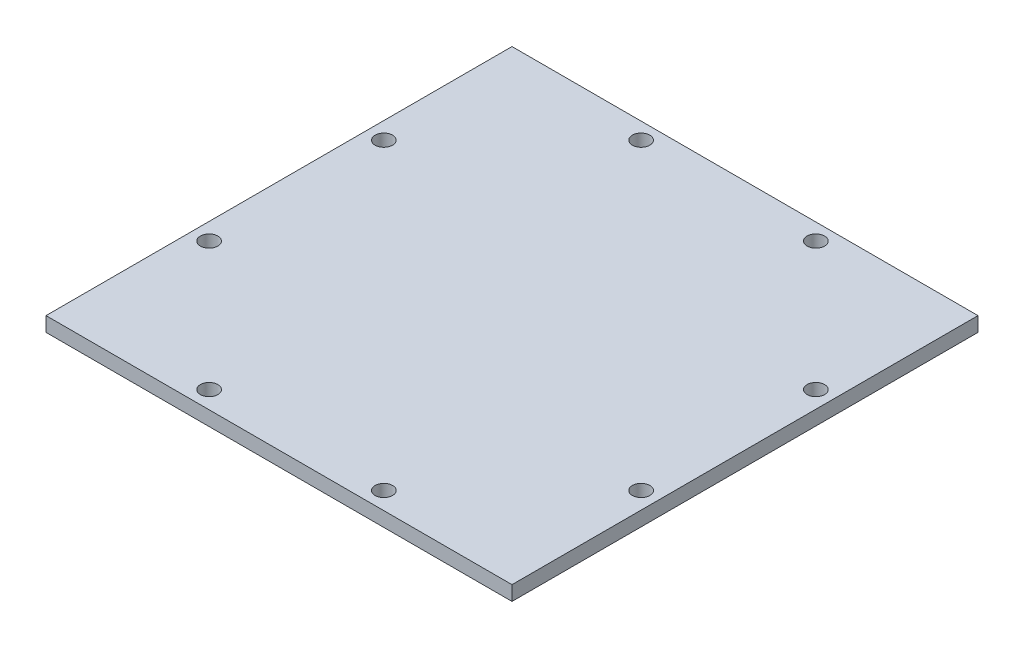
ISO-10303-21;
HEADER;
FILE_DESCRIPTION(('STEP AP214'),'2;1');
FILE_NAME('part.step','',(''),(''),'','','');
FILE_SCHEMA(('AUTOMOTIVE_DESIGN { 1 0 10303 214 1 1 1 1 }'));
ENDSEC;
DATA;
#1=APPLICATION_CONTEXT('core data for automotive mechanical design processes');
#2=APPLICATION_PROTOCOL_DEFINITION('international standard','automotive_design',2000,#1);
#3=PRODUCT_CONTEXT('',#1,'mechanical');
#4=PRODUCT('Part','Part','',(#3));
#5=PRODUCT_RELATED_PRODUCT_CATEGORY('part','',(#4));
#6=PRODUCT_DEFINITION_FORMATION('','',#4);
#7=PRODUCT_DEFINITION_CONTEXT('part definition',#1,'design');
#8=PRODUCT_DEFINITION('design','',#6,#7);
#9=PRODUCT_DEFINITION_SHAPE('','',#8);
#10=(LENGTH_UNIT() NAMED_UNIT(*) SI_UNIT(.MILLI.,.METRE.));
#11=(NAMED_UNIT(*) PLANE_ANGLE_UNIT() SI_UNIT($,.RADIAN.));
#12=(NAMED_UNIT(*) SI_UNIT($,.STERADIAN.) SOLID_ANGLE_UNIT());
#13=UNCERTAINTY_MEASURE_WITH_UNIT(LENGTH_MEASURE(1.E-05),#10,'distance_accuracy_value','');
#14=(GEOMETRIC_REPRESENTATION_CONTEXT(3) GLOBAL_UNCERTAINTY_ASSIGNED_CONTEXT((#13)) GLOBAL_UNIT_ASSIGNED_CONTEXT((#10,
#11,#12)) REPRESENTATION_CONTEXT('',''));
#15=CARTESIAN_POINT('',(0.,0.,0.));
#16=DIRECTION('',(0.,0.,1.));
#17=DIRECTION('',(1.,0.,0.));
#18=AXIS2_PLACEMENT_3D('',#15,#16,#17);
#19=CARTESIAN_POINT('',(40.,2.5,40.));
#20=DIRECTION('',(-1.,0.,0.));
#21=DIRECTION('',(0.,0.,1.));
#22=AXIS2_PLACEMENT_3D('',#19,#20,#21);
#23=PLANE('',#22);
#24=DIRECTION('',(0.,0.,-1.));
#25=VECTOR('',#24,1.);
#26=CARTESIAN_POINT('',(40.,0.,40.));
#27=LINE('',#26,#25);
#28=CARTESIAN_POINT('',(40.,0.,40.));
#29=VERTEX_POINT('',#28);
#30=CARTESIAN_POINT('',(40.,0.,-40.));
#31=VERTEX_POINT('',#30);
#32=EDGE_CURVE('E105',#29,#31,#27,.T.);
#33=ORIENTED_EDGE('',*,*,#32,.T.);
#34=DIRECTION('',(0.,-1.,0.));
#35=VECTOR('',#34,1.);
#36=CARTESIAN_POINT('',(40.,2.5,-40.));
#37=LINE('',#36,#35);
#38=CARTESIAN_POINT('',(40.,2.5,-40.));
#39=VERTEX_POINT('',#38);
#40=EDGE_CURVE('E11',#39,#31,#37,.T.);
#41=ORIENTED_EDGE('',*,*,#40,.F.);
#42=DIRECTION('',(0.,0.,-1.));
#43=VECTOR('',#42,1.);
#44=CARTESIAN_POINT('',(40.,2.5,40.));
#45=LINE('',#44,#43);
#46=CARTESIAN_POINT('',(40.,2.5,40.));
#47=VERTEX_POINT('',#46);
#48=EDGE_CURVE('E92',#47,#39,#45,.T.);
#49=ORIENTED_EDGE('',*,*,#48,.F.);
#50=DIRECTION('',(0.,-1.,0.));
#51=VECTOR('',#50,1.);
#52=CARTESIAN_POINT('',(40.,2.5,40.));
#53=LINE('',#52,#51);
#54=EDGE_CURVE('E101',#47,#29,#53,.T.);
#55=ORIENTED_EDGE('',*,*,#54,.T.);
#56=EDGE_LOOP('',(#33,#41,#49,#55));
#57=FACE_BOUND('',#56,.T.);
#58=ADVANCED_FACE('F39',(#57),#23,.F.);
#59=CARTESIAN_POINT('',(-40.,2.5,-40.));
#60=DIRECTION('',(0.,0.,1.));
#61=DIRECTION('',(1.,0.,0.));
#62=AXIS2_PLACEMENT_3D('',#59,#60,#61);
#63=PLANE('',#62);
#64=DIRECTION('',(-1.,0.,0.));
#65=VECTOR('',#64,1.);
#66=CARTESIAN_POINT('',(-40.,0.,-40.));
#67=LINE('',#66,#65);
#68=CARTESIAN_POINT('',(-40.,0.,-40.));
#69=VERTEX_POINT('',#68);
#70=EDGE_CURVE('E96',#31,#69,#67,.T.);
#71=ORIENTED_EDGE('',*,*,#70,.T.);
#72=DIRECTION('',(0.,-1.,0.));
#73=VECTOR('',#72,1.);
#74=CARTESIAN_POINT('',(-40.,2.5,-40.));
#75=LINE('',#74,#73);
#76=CARTESIAN_POINT('',(-40.,2.5,-40.));
#77=VERTEX_POINT('',#76);
#78=EDGE_CURVE('E48',#77,#69,#75,.T.);
#79=ORIENTED_EDGE('',*,*,#78,.F.);
#80=DIRECTION('',(-1.,0.,0.));
#81=VECTOR('',#80,1.);
#82=CARTESIAN_POINT('',(-40.,2.5,-40.));
#83=LINE('',#82,#81);
#84=EDGE_CURVE('E87',#39,#77,#83,.T.);
#85=ORIENTED_EDGE('',*,*,#84,.F.);
#86=ORIENTED_EDGE('',*,*,#40,.T.);
#87=EDGE_LOOP('',(#71,#79,#85,#86));
#88=FACE_BOUND('',#87,.T.);
#89=ADVANCED_FACE('F95',(#88),#63,.F.);
#90=CARTESIAN_POINT('',(-40.,2.5,40.));
#91=DIRECTION('',(1.,0.,0.));
#92=DIRECTION('',(0.,0.,-1.));
#93=AXIS2_PLACEMENT_3D('',#90,#91,#92);
#94=PLANE('',#93);
#95=DIRECTION('',(0.,0.,1.));
#96=VECTOR('',#95,1.);
#97=CARTESIAN_POINT('',(-40.,0.,40.));
#98=LINE('',#97,#96);
#99=CARTESIAN_POINT('',(-40.,0.,40.));
#100=VERTEX_POINT('',#99);
#101=EDGE_CURVE('E74',#69,#100,#98,.T.);
#102=ORIENTED_EDGE('',*,*,#101,.T.);
#103=DIRECTION('',(0.,-1.,0.));
#104=VECTOR('',#103,1.);
#105=CARTESIAN_POINT('',(-40.,2.5,40.));
#106=LINE('',#105,#104);
#107=CARTESIAN_POINT('',(-40.,2.5,40.));
#108=VERTEX_POINT('',#107);
#109=EDGE_CURVE('E97',#108,#100,#106,.T.);
#110=ORIENTED_EDGE('',*,*,#109,.F.);
#111=DIRECTION('',(0.,0.,1.));
#112=VECTOR('',#111,1.);
#113=CARTESIAN_POINT('',(-40.,2.5,40.));
#114=LINE('',#113,#112);
#115=EDGE_CURVE('E90',#77,#108,#114,.T.);
#116=ORIENTED_EDGE('',*,*,#115,.F.);
#117=ORIENTED_EDGE('',*,*,#78,.T.);
#118=EDGE_LOOP('',(#102,#110,#116,#117));
#119=FACE_BOUND('',#118,.T.);
#120=ADVANCED_FACE('F99',(#119),#94,.F.);
#121=CARTESIAN_POINT('',(-40.,2.5,40.));
#122=DIRECTION('',(0.,0.,-1.));
#123=DIRECTION('',(-1.,0.,0.));
#124=AXIS2_PLACEMENT_3D('',#121,#122,#123);
#125=PLANE('',#124);
#126=DIRECTION('',(1.,0.,0.));
#127=VECTOR('',#126,1.);
#128=CARTESIAN_POINT('',(-40.,0.,40.));
#129=LINE('',#128,#127);
#130=EDGE_CURVE('E80',#100,#29,#129,.T.);
#131=ORIENTED_EDGE('',*,*,#130,.T.);
#132=ORIENTED_EDGE('',*,*,#54,.F.);
#133=DIRECTION('',(1.,0.,0.));
#134=VECTOR('',#133,1.);
#135=CARTESIAN_POINT('',(-40.,2.5,40.));
#136=LINE('',#135,#134);
#137=EDGE_CURVE('E57',#108,#47,#136,.T.);
#138=ORIENTED_EDGE('',*,*,#137,.F.);
#139=ORIENTED_EDGE('',*,*,#109,.T.);
#140=EDGE_LOOP('',(#131,#132,#138,#139));
#141=FACE_BOUND('',#140,.T.);
#142=ADVANCED_FACE('F170',(#141),#125,.F.);
#143=CARTESIAN_POINT('',(0.,2.5,0.));
#144=DIRECTION('',(0.,-1.,0.));
#145=DIRECTION('',(0.,0.,-1.));
#146=AXIS2_PLACEMENT_3D('',#143,#144,#145);
#147=PLANE('',#146);
#148=CARTESIAN_POINT('',(-37.0819114331917,2.5,14.9180885668085));
#149=DIRECTION('',(0.,1.,0.));
#150=DIRECTION('',(-1.,0.,0.));
#151=AXIS2_PLACEMENT_3D('',#148,#149,#150);
#152=CIRCLE('',#151,1.5);
#153=CARTESIAN_POINT('',(-38.5819114331917,2.5,14.9180885668085));
#154=VERTEX_POINT('',#153);
#155=EDGE_CURVE('E150',#154,#154,#152,.T.);
#156=ORIENTED_EDGE('',*,*,#155,.F.);
#157=EDGE_LOOP('',(#156));
#158=FACE_BOUND('',#157,.T.);
#159=CARTESIAN_POINT('',(-37.0819114331921,2.5,-15.0819114331915));
#160=DIRECTION('',(0.,1.,0.));
#161=DIRECTION('',(-1.,0.,0.));
#162=AXIS2_PLACEMENT_3D('',#159,#160,#161);
#163=CIRCLE('',#162,1.5);
#164=CARTESIAN_POINT('',(-38.5819114331921,2.5,-15.0819114331915));
#165=VERTEX_POINT('',#164);
#166=EDGE_CURVE('E153',#165,#165,#163,.T.);
#167=ORIENTED_EDGE('',*,*,#166,.F.);
#168=EDGE_LOOP('',(#167));
#169=FACE_BOUND('',#168,.T.);
#170=CARTESIAN_POINT('',(-15.,2.5,-37.1638228663838));
#171=DIRECTION('',(0.,1.,0.));
#172=DIRECTION('',(0.,0.,-1.));
#173=AXIS2_PLACEMENT_3D('',#170,#171,#172);
#174=CIRCLE('',#173,1.5);
#175=CARTESIAN_POINT('',(-15.,2.5,-38.6638228663838));
#176=VERTEX_POINT('',#175);
#177=EDGE_CURVE('E156',#176,#176,#174,.T.);
#178=ORIENTED_EDGE('',*,*,#177,.F.);
#179=EDGE_LOOP('',(#178));
#180=FACE_BOUND('',#179,.T.);
#181=CARTESIAN_POINT('',(15.,2.5,-37.1638228663838));
#182=DIRECTION('',(0.,1.,0.));
#183=DIRECTION('',(0.,0.,-1.));
#184=AXIS2_PLACEMENT_3D('',#181,#182,#183);
#185=CIRCLE('',#184,1.5);
#186=CARTESIAN_POINT('',(15.,2.5,-38.6638228663838));
#187=VERTEX_POINT('',#186);
#188=EDGE_CURVE('E159',#187,#187,#185,.T.);
#189=ORIENTED_EDGE('',*,*,#188,.F.);
#190=EDGE_LOOP('',(#189));
#191=FACE_BOUND('',#190,.T.);
#192=CARTESIAN_POINT('',(37.0819114331918,2.5,-15.081911433192));
#193=DIRECTION('',(0.,1.,0.));
#194=DIRECTION('',(1.,0.,0.));
#195=AXIS2_PLACEMENT_3D('',#192,#193,#194);
#196=CIRCLE('',#195,1.5);
#197=CARTESIAN_POINT('',(38.5819114331918,2.5,-15.081911433192));
#198=VERTEX_POINT('',#197);
#199=EDGE_CURVE('E149',#198,#198,#196,.T.);
#200=ORIENTED_EDGE('',*,*,#199,.F.);
#201=EDGE_LOOP('',(#200));
#202=FACE_BOUND('',#201,.T.);
#203=CARTESIAN_POINT('',(37.0819114331919,2.5,14.918088566808));
#204=DIRECTION('',(0.,1.,0.));
#205=DIRECTION('',(1.,0.,0.));
#206=AXIS2_PLACEMENT_3D('',#203,#204,#205);
#207=CIRCLE('',#206,1.5);
#208=CARTESIAN_POINT('',(38.5819114331919,2.5,14.918088566808));
#209=VERTEX_POINT('',#208);
#210=EDGE_CURVE('E124',#209,#209,#207,.T.);
#211=ORIENTED_EDGE('',*,*,#210,.F.);
#212=EDGE_LOOP('',(#211));
#213=FACE_BOUND('',#212,.T.);
#214=CARTESIAN_POINT('',(-15.,2.5,37.));
#215=DIRECTION('',(0.,1.,0.));
#216=DIRECTION('',(0.,0.,1.));
#217=AXIS2_PLACEMENT_3D('',#214,#215,#216);
#218=CIRCLE('',#217,1.5);
#219=CARTESIAN_POINT('',(-15.,2.5,38.5));
#220=VERTEX_POINT('',#219);
#221=EDGE_CURVE('E117',#220,#220,#218,.T.);
#222=ORIENTED_EDGE('',*,*,#221,.F.);
#223=EDGE_LOOP('',(#222));
#224=FACE_BOUND('',#223,.T.);
#225=CARTESIAN_POINT('',(15.,2.5,37.));
#226=DIRECTION('',(0.,1.,0.));
#227=DIRECTION('',(0.,0.,1.));
#228=AXIS2_PLACEMENT_3D('',#225,#226,#227);
#229=CIRCLE('',#228,1.5);
#230=CARTESIAN_POINT('',(15.,2.5,38.5));
#231=VERTEX_POINT('',#230);
#232=EDGE_CURVE('E137',#231,#231,#229,.T.);
#233=ORIENTED_EDGE('',*,*,#232,.F.);
#234=EDGE_LOOP('',(#233));
#235=FACE_BOUND('',#234,.T.);
#236=ORIENTED_EDGE('',*,*,#48,.T.);
#237=ORIENTED_EDGE('',*,*,#84,.T.);
#238=ORIENTED_EDGE('',*,*,#115,.T.);
#239=ORIENTED_EDGE('',*,*,#137,.T.);
#240=EDGE_LOOP('',(#236,#237,#238,#239));
#241=FACE_BOUND('',#240,.T.);
#242=ADVANCED_FACE('F88',(#158,#169,#180,#191,#202,#213,#224,#235,#241),#147,.F.);
#243=CARTESIAN_POINT('',(0.,0.,0.));
#244=DIRECTION('',(0.,-1.,0.));
#245=DIRECTION('',(0.,0.,-1.));
#246=AXIS2_PLACEMENT_3D('',#243,#244,#245);
#247=PLANE('',#246);
#248=CARTESIAN_POINT('',(-37.0819114331917,0.,14.9180885668085));
#249=DIRECTION('',(0.,-1.,0.));
#250=DIRECTION('',(0.,0.,-1.));
#251=AXIS2_PLACEMENT_3D('',#248,#249,#250);
#252=CIRCLE('',#251,1.5);
#253=CARTESIAN_POINT('',(-37.0819114331917,0.,13.4180885668085));
#254=VERTEX_POINT('',#253);
#255=EDGE_CURVE('E42',#254,#254,#252,.T.);
#256=ORIENTED_EDGE('',*,*,#255,.F.);
#257=EDGE_LOOP('',(#256));
#258=FACE_BOUND('',#257,.T.);
#259=CARTESIAN_POINT('',(-37.0819114331921,0.,-15.0819114331915));
#260=DIRECTION('',(0.,-1.,0.));
#261=DIRECTION('',(0.,0.,-1.));
#262=AXIS2_PLACEMENT_3D('',#259,#260,#261);
#263=CIRCLE('',#262,1.5);
#264=CARTESIAN_POINT('',(-37.0819114331921,0.,-16.5819114331915));
#265=VERTEX_POINT('',#264);
#266=EDGE_CURVE('E132',#265,#265,#263,.T.);
#267=ORIENTED_EDGE('',*,*,#266,.F.);
#268=EDGE_LOOP('',(#267));
#269=FACE_BOUND('',#268,.T.);
#270=CARTESIAN_POINT('',(-15.,0.,-37.1638228663838));
#271=DIRECTION('',(0.,-1.,0.));
#272=DIRECTION('',(0.,0.,-1.));
#273=AXIS2_PLACEMENT_3D('',#270,#271,#272);
#274=CIRCLE('',#273,1.5);
#275=CARTESIAN_POINT('',(-15.,0.,-38.6638228663838));
#276=VERTEX_POINT('',#275);
#277=EDGE_CURVE('E130',#276,#276,#274,.T.);
#278=ORIENTED_EDGE('',*,*,#277,.F.);
#279=EDGE_LOOP('',(#278));
#280=FACE_BOUND('',#279,.T.);
#281=CARTESIAN_POINT('',(15.,0.,-37.1638228663838));
#282=DIRECTION('',(0.,-1.,0.));
#283=DIRECTION('',(0.,0.,-1.));
#284=AXIS2_PLACEMENT_3D('',#281,#282,#283);
#285=CIRCLE('',#284,1.5);
#286=CARTESIAN_POINT('',(15.,0.,-38.6638228663838));
#287=VERTEX_POINT('',#286);
#288=EDGE_CURVE('E127',#287,#287,#285,.T.);
#289=ORIENTED_EDGE('',*,*,#288,.F.);
#290=EDGE_LOOP('',(#289));
#291=FACE_BOUND('',#290,.T.);
#292=CARTESIAN_POINT('',(37.0819114331918,0.,-15.081911433192));
#293=DIRECTION('',(0.,-1.,0.));
#294=DIRECTION('',(0.,0.,-1.));
#295=AXIS2_PLACEMENT_3D('',#292,#293,#294);
#296=CIRCLE('',#295,1.5);
#297=CARTESIAN_POINT('',(37.0819114331918,0.,-16.581911433192));
#298=VERTEX_POINT('',#297);
#299=EDGE_CURVE('E123',#298,#298,#296,.T.);
#300=ORIENTED_EDGE('',*,*,#299,.F.);
#301=EDGE_LOOP('',(#300));
#302=FACE_BOUND('',#301,.T.);
#303=CARTESIAN_POINT('',(37.0819114331919,0.,14.918088566808));
#304=DIRECTION('',(0.,-1.,0.));
#305=DIRECTION('',(0.,0.,-1.));
#306=AXIS2_PLACEMENT_3D('',#303,#304,#305);
#307=CIRCLE('',#306,1.5);
#308=CARTESIAN_POINT('',(37.0819114331919,0.,13.418088566808));
#309=VERTEX_POINT('',#308);
#310=EDGE_CURVE('E120',#309,#309,#307,.T.);
#311=ORIENTED_EDGE('',*,*,#310,.F.);
#312=EDGE_LOOP('',(#311));
#313=FACE_BOUND('',#312,.T.);
#314=CARTESIAN_POINT('',(-15.,0.,37.));
#315=DIRECTION('',(0.,-1.,0.));
#316=DIRECTION('',(0.,0.,-1.));
#317=AXIS2_PLACEMENT_3D('',#314,#315,#316);
#318=CIRCLE('',#317,1.5);
#319=CARTESIAN_POINT('',(-15.,0.,35.5));
#320=VERTEX_POINT('',#319);
#321=EDGE_CURVE('E108',#320,#320,#318,.T.);
#322=ORIENTED_EDGE('',*,*,#321,.F.);
#323=EDGE_LOOP('',(#322));
#324=FACE_BOUND('',#323,.T.);
#325=CARTESIAN_POINT('',(15.,0.,37.));
#326=DIRECTION('',(0.,-1.,0.));
#327=DIRECTION('',(0.,0.,-1.));
#328=AXIS2_PLACEMENT_3D('',#325,#326,#327);
#329=CIRCLE('',#328,1.5);
#330=CARTESIAN_POINT('',(15.,0.,35.5));
#331=VERTEX_POINT('',#330);
#332=EDGE_CURVE('E114',#331,#331,#329,.T.);
#333=ORIENTED_EDGE('',*,*,#332,.F.);
#334=EDGE_LOOP('',(#333));
#335=FACE_BOUND('',#334,.T.);
#336=ORIENTED_EDGE('',*,*,#32,.F.);
#337=ORIENTED_EDGE('',*,*,#130,.F.);
#338=ORIENTED_EDGE('',*,*,#101,.F.);
#339=ORIENTED_EDGE('',*,*,#70,.F.);
#340=EDGE_LOOP('',(#336,#337,#338,#339));
#341=FACE_BOUND('',#340,.T.);
#342=ADVANCED_FACE('F169',(#258,#269,#280,#291,#302,#313,#324,#335,#341),#247,.T.);
#343=CARTESIAN_POINT('',(15.,-7.5,37.));
#344=DIRECTION('',(0.,1.,0.));
#345=DIRECTION('',(0.,0.,1.));
#346=AXIS2_PLACEMENT_3D('',#343,#344,#345);
#347=CYLINDRICAL_SURFACE('',#346,1.5);
#348=ORIENTED_EDGE('',*,*,#332,.T.);
#349=EDGE_LOOP('',(#348));
#350=FACE_BOUND('',#349,.T.);
#351=ORIENTED_EDGE('',*,*,#232,.T.);
#352=EDGE_LOOP('',(#351));
#353=FACE_BOUND('',#352,.T.);
#354=ADVANCED_FACE('F181',(#350,#353),#347,.F.);
#355=CARTESIAN_POINT('',(-15.,-7.5,37.));
#356=DIRECTION('',(0.,1.,0.));
#357=DIRECTION('',(0.,0.,1.));
#358=AXIS2_PLACEMENT_3D('',#355,#356,#357);
#359=CYLINDRICAL_SURFACE('',#358,1.5);
#360=ORIENTED_EDGE('',*,*,#321,.T.);
#361=EDGE_LOOP('',(#360));
#362=FACE_BOUND('',#361,.T.);
#363=ORIENTED_EDGE('',*,*,#221,.T.);
#364=EDGE_LOOP('',(#363));
#365=FACE_BOUND('',#364,.T.);
#366=ADVANCED_FACE('F178',(#362,#365),#359,.F.);
#367=CARTESIAN_POINT('',(37.0819114331919,-7.5,14.918088566808));
#368=DIRECTION('',(0.,1.,0.));
#369=DIRECTION('',(0.,0.,1.));
#370=AXIS2_PLACEMENT_3D('',#367,#368,#369);
#371=CYLINDRICAL_SURFACE('',#370,1.5);
#372=ORIENTED_EDGE('',*,*,#310,.T.);
#373=EDGE_LOOP('',(#372));
#374=FACE_BOUND('',#373,.T.);
#375=ORIENTED_EDGE('',*,*,#210,.T.);
#376=EDGE_LOOP('',(#375));
#377=FACE_BOUND('',#376,.T.);
#378=ADVANCED_FACE('F180',(#374,#377),#371,.F.);
#379=CARTESIAN_POINT('',(37.0819114331918,-7.5,-15.081911433192));
#380=DIRECTION('',(0.,1.,0.));
#381=DIRECTION('',(0.,0.,1.));
#382=AXIS2_PLACEMENT_3D('',#379,#380,#381);
#383=CYLINDRICAL_SURFACE('',#382,1.5);
#384=ORIENTED_EDGE('',*,*,#299,.T.);
#385=EDGE_LOOP('',(#384));
#386=FACE_BOUND('',#385,.T.);
#387=ORIENTED_EDGE('',*,*,#199,.T.);
#388=EDGE_LOOP('',(#387));
#389=FACE_BOUND('',#388,.T.);
#390=ADVANCED_FACE('F165',(#386,#389),#383,.F.);
#391=CARTESIAN_POINT('',(15.,-7.5,-37.1638228663838));
#392=DIRECTION('',(0.,1.,0.));
#393=DIRECTION('',(0.,0.,1.));
#394=AXIS2_PLACEMENT_3D('',#391,#392,#393);
#395=CYLINDRICAL_SURFACE('',#394,1.5);
#396=ORIENTED_EDGE('',*,*,#288,.T.);
#397=EDGE_LOOP('',(#396));
#398=FACE_BOUND('',#397,.T.);
#399=ORIENTED_EDGE('',*,*,#188,.T.);
#400=EDGE_LOOP('',(#399));
#401=FACE_BOUND('',#400,.T.);
#402=ADVANCED_FACE('F247',(#398,#401),#395,.F.);
#403=CARTESIAN_POINT('',(-15.,-7.5,-37.1638228663838));
#404=DIRECTION('',(0.,1.,0.));
#405=DIRECTION('',(0.,0.,1.));
#406=AXIS2_PLACEMENT_3D('',#403,#404,#405);
#407=CYLINDRICAL_SURFACE('',#406,1.5);
#408=ORIENTED_EDGE('',*,*,#277,.T.);
#409=EDGE_LOOP('',(#408));
#410=FACE_BOUND('',#409,.T.);
#411=ORIENTED_EDGE('',*,*,#177,.T.);
#412=EDGE_LOOP('',(#411));
#413=FACE_BOUND('',#412,.T.);
#414=ADVANCED_FACE('F257',(#410,#413),#407,.F.);
#415=CARTESIAN_POINT('',(-37.0819114331921,-7.5,-15.0819114331915));
#416=DIRECTION('',(0.,1.,0.));
#417=DIRECTION('',(0.,0.,1.));
#418=AXIS2_PLACEMENT_3D('',#415,#416,#417);
#419=CYLINDRICAL_SURFACE('',#418,1.5);
#420=ORIENTED_EDGE('',*,*,#266,.T.);
#421=EDGE_LOOP('',(#420));
#422=FACE_BOUND('',#421,.T.);
#423=ORIENTED_EDGE('',*,*,#166,.T.);
#424=EDGE_LOOP('',(#423));
#425=FACE_BOUND('',#424,.T.);
#426=ADVANCED_FACE('F267',(#422,#425),#419,.F.);
#427=CARTESIAN_POINT('',(-37.0819114331917,-7.5,14.9180885668085));
#428=DIRECTION('',(0.,1.,0.));
#429=DIRECTION('',(0.,0.,1.));
#430=AXIS2_PLACEMENT_3D('',#427,#428,#429);
#431=CYLINDRICAL_SURFACE('',#430,1.5);
#432=ORIENTED_EDGE('',*,*,#255,.T.);
#433=EDGE_LOOP('',(#432));
#434=FACE_BOUND('',#433,.T.);
#435=ORIENTED_EDGE('',*,*,#155,.T.);
#436=EDGE_LOOP('',(#435));
#437=FACE_BOUND('',#436,.T.);
#438=ADVANCED_FACE('F277',(#434,#437),#431,.F.);
#439=CLOSED_SHELL('',(#58,#89,#120,#142,#242,#342,#354,#366,#378,#390,#402,#414,#426,#438));
#440=MANIFOLD_SOLID_BREP('B2',#439);
#441=ADVANCED_BREP_SHAPE_REPRESENTATION('',(#18,#440),#14);
#442=SHAPE_DEFINITION_REPRESENTATION(#9,#441);
ENDSEC;
END-ISO-10303-21;
